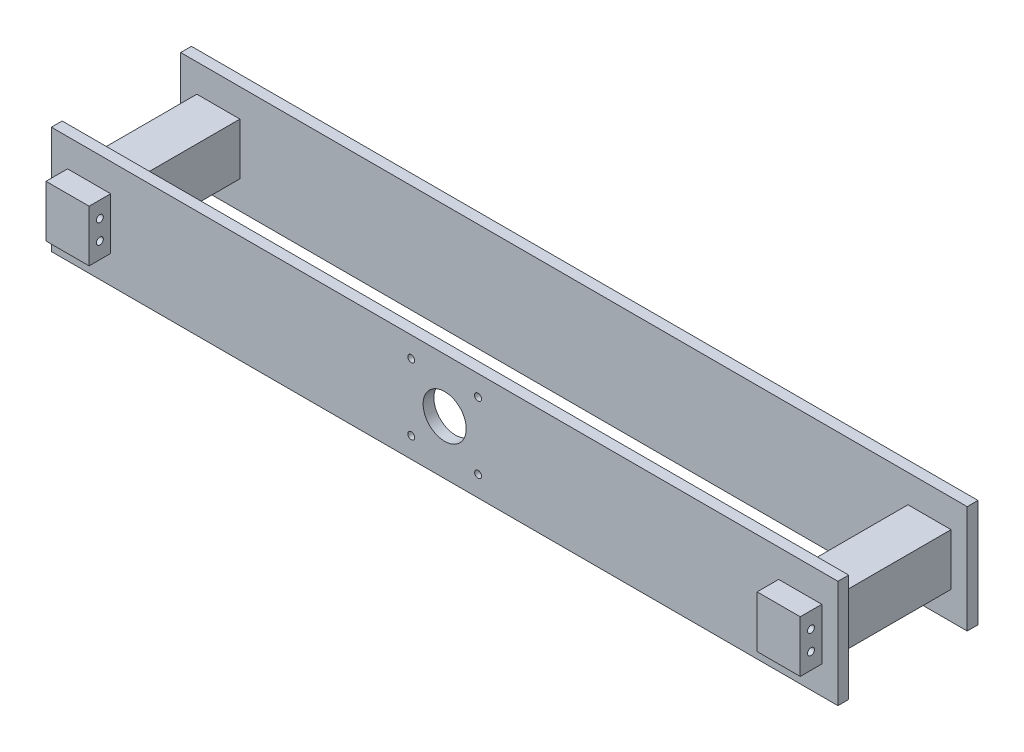
ISO-10303-21;
HEADER;
FILE_DESCRIPTION(('STEP AP214'),'2;1');
FILE_NAME('part.step','',(''),(''),'','','');
FILE_SCHEMA(('AUTOMOTIVE_DESIGN { 1 0 10303 214 1 1 1 1 }'));
ENDSEC;
DATA;
#1=APPLICATION_CONTEXT('core data for automotive mechanical design processes');
#2=APPLICATION_PROTOCOL_DEFINITION('international standard','automotive_design',2000,#1);
#3=PRODUCT_CONTEXT('',#1,'mechanical');
#4=PRODUCT('Part','Part','',(#3));
#5=PRODUCT_RELATED_PRODUCT_CATEGORY('part','',(#4));
#6=PRODUCT_DEFINITION_FORMATION('','',#4);
#7=PRODUCT_DEFINITION_CONTEXT('part definition',#1,'design');
#8=PRODUCT_DEFINITION('design','',#6,#7);
#9=PRODUCT_DEFINITION_SHAPE('','',#8);
#10=(LENGTH_UNIT() NAMED_UNIT(*) SI_UNIT(.MILLI.,.METRE.));
#11=(NAMED_UNIT(*) PLANE_ANGLE_UNIT() SI_UNIT($,.RADIAN.));
#12=(NAMED_UNIT(*) SI_UNIT($,.STERADIAN.) SOLID_ANGLE_UNIT());
#13=UNCERTAINTY_MEASURE_WITH_UNIT(LENGTH_MEASURE(1.E-05),#10,'distance_accuracy_value','');
#14=(GEOMETRIC_REPRESENTATION_CONTEXT(3) GLOBAL_UNCERTAINTY_ASSIGNED_CONTEXT((#13)) GLOBAL_UNIT_ASSIGNED_CONTEXT((#10,
#11,#12)) REPRESENTATION_CONTEXT('',''));
#15=CARTESIAN_POINT('',(0.,0.,0.));
#16=DIRECTION('',(0.,0.,1.));
#17=DIRECTION('',(1.,0.,0.));
#18=AXIS2_PLACEMENT_3D('',#15,#16,#17);
#19=CARTESIAN_POINT('',(0.,0.,2.5));
#20=DIRECTION('',(0.,0.,-1.));
#21=DIRECTION('',(-1.,0.,0.));
#22=AXIS2_PLACEMENT_3D('',#19,#20,#21);
#23=PLANE('',#22);
#24=DIRECTION('',(0.,1.,0.));
#25=VECTOR('',#24,1.);
#26=CARTESIAN_POINT('',(175.,-12.,2.5));
#27=LINE('',#26,#25);
#28=CARTESIAN_POINT('',(175.,-12.,2.5));
#29=VERTEX_POINT('',#28);
#30=CARTESIAN_POINT('',(175.,12.,2.5));
#31=VERTEX_POINT('',#30);
#32=EDGE_CURVE('E292',#29,#31,#27,.T.);
#33=ORIENTED_EDGE('',*,*,#32,.F.);
#34=DIRECTION('',(1.,0.,0.));
#35=VECTOR('',#34,1.);
#36=CARTESIAN_POINT('',(175.,-12.,2.5));
#37=LINE('',#36,#35);
#38=CARTESIAN_POINT('',(155.,-12.,2.5));
#39=VERTEX_POINT('',#38);
#40=EDGE_CURVE('E327',#39,#29,#37,.T.);
#41=ORIENTED_EDGE('',*,*,#40,.F.);
#42=DIRECTION('',(0.,-1.,0.));
#43=VECTOR('',#42,1.);
#44=CARTESIAN_POINT('',(155.,-12.,2.5));
#45=LINE('',#44,#43);
#46=CARTESIAN_POINT('',(155.,12.,2.5));
#47=VERTEX_POINT('',#46);
#48=EDGE_CURVE('E330',#47,#39,#45,.T.);
#49=ORIENTED_EDGE('',*,*,#48,.F.);
#50=DIRECTION('',(-1.,0.,0.));
#51=VECTOR('',#50,1.);
#52=CARTESIAN_POINT('',(175.,12.,2.5));
#53=LINE('',#52,#51);
#54=EDGE_CURVE('E334',#31,#47,#53,.T.);
#55=ORIENTED_EDGE('',*,*,#54,.F.);
#56=EDGE_LOOP('',(#33,#41,#49,#55));
#57=FACE_BOUND('',#56,.T.);
#58=DIRECTION('',(0.,1.,0.));
#59=VECTOR('',#58,1.);
#60=CARTESIAN_POINT('',(182.5,-25.,2.5));
#61=LINE('',#60,#59);
#62=CARTESIAN_POINT('',(182.5,-25.,2.5));
#63=VERTEX_POINT('',#62);
#64=CARTESIAN_POINT('',(182.5,25.,2.5));
#65=VERTEX_POINT('',#64);
#66=EDGE_CURVE('E346',#63,#65,#61,.T.);
#67=ORIENTED_EDGE('',*,*,#66,.T.);
#68=DIRECTION('',(-1.,0.,0.));
#69=VECTOR('',#68,1.);
#70=CARTESIAN_POINT('',(-182.5,25.,2.5));
#71=LINE('',#70,#69);
#72=CARTESIAN_POINT('',(-182.5,25.,2.5));
#73=VERTEX_POINT('',#72);
#74=EDGE_CURVE('E349',#65,#73,#71,.T.);
#75=ORIENTED_EDGE('',*,*,#74,.T.);
#76=DIRECTION('',(0.,-1.,0.));
#77=VECTOR('',#76,1.);
#78=CARTESIAN_POINT('',(-182.5,-25.,2.5));
#79=LINE('',#78,#77);
#80=CARTESIAN_POINT('',(-182.5,-25.,2.5));
#81=VERTEX_POINT('',#80);
#82=EDGE_CURVE('E352',#73,#81,#79,.T.);
#83=ORIENTED_EDGE('',*,*,#82,.T.);
#84=DIRECTION('',(1.,0.,0.));
#85=VECTOR('',#84,1.);
#86=CARTESIAN_POINT('',(-182.5,-25.,2.5));
#87=LINE('',#86,#85);
#88=EDGE_CURVE('E354',#81,#63,#87,.T.);
#89=ORIENTED_EDGE('',*,*,#88,.T.);
#90=EDGE_LOOP('',(#67,#75,#83,#89));
#91=FACE_BOUND('',#90,.T.);
#92=DIRECTION('',(0.,1.,0.));
#93=VECTOR('',#92,1.);
#94=CARTESIAN_POINT('',(-155.,-12.,2.5));
#95=LINE('',#94,#93);
#96=CARTESIAN_POINT('',(-155.,-12.,2.5));
#97=VERTEX_POINT('',#96);
#98=CARTESIAN_POINT('',(-155.,12.,2.5));
#99=VERTEX_POINT('',#98);
#100=EDGE_CURVE('E288',#97,#99,#95,.T.);
#101=ORIENTED_EDGE('',*,*,#100,.F.);
#102=DIRECTION('',(1.,0.,0.));
#103=VECTOR('',#102,1.);
#104=CARTESIAN_POINT('',(-175.,-12.,2.5));
#105=LINE('',#104,#103);
#106=CARTESIAN_POINT('',(-175.,-12.,2.5));
#107=VERTEX_POINT('',#106);
#108=EDGE_CURVE('E281',#107,#97,#105,.T.);
#109=ORIENTED_EDGE('',*,*,#108,.F.);
#110=DIRECTION('',(0.,-1.,0.));
#111=VECTOR('',#110,1.);
#112=CARTESIAN_POINT('',(-175.,-12.,2.5));
#113=LINE('',#112,#111);
#114=CARTESIAN_POINT('',(-175.,12.,2.5));
#115=VERTEX_POINT('',#114);
#116=EDGE_CURVE('E295',#115,#107,#113,.T.);
#117=ORIENTED_EDGE('',*,*,#116,.F.);
#118=DIRECTION('',(-1.,0.,0.));
#119=VECTOR('',#118,1.);
#120=CARTESIAN_POINT('',(-175.,12.,2.5));
#121=LINE('',#120,#119);
#122=EDGE_CURVE('E291',#99,#115,#121,.T.);
#123=ORIENTED_EDGE('',*,*,#122,.F.);
#124=EDGE_LOOP('',(#101,#109,#117,#123));
#125=FACE_BOUND('',#124,.T.);
#126=ADVANCED_FACE('F41',(#57,#91,#125),#23,.F.);
#127=CARTESIAN_POINT('',(182.5,-25.,2.5));
#128=DIRECTION('',(-1.,0.,0.));
#129=DIRECTION('',(0.,0.,1.));
#130=AXIS2_PLACEMENT_3D('',#127,#128,#129);
#131=PLANE('',#130);
#132=DIRECTION('',(0.,1.,0.));
#133=VECTOR('',#132,1.);
#134=CARTESIAN_POINT('',(182.5,-25.,-2.5));
#135=LINE('',#134,#133);
#136=CARTESIAN_POINT('',(182.5,-25.,-2.5));
#137=VERTEX_POINT('',#136);
#138=CARTESIAN_POINT('',(182.5,25.,-2.5));
#139=VERTEX_POINT('',#138);
#140=EDGE_CURVE('E314',#137,#139,#135,.T.);
#141=ORIENTED_EDGE('',*,*,#140,.T.);
#142=DIRECTION('',(0.,0.,-1.));
#143=VECTOR('',#142,1.);
#144=CARTESIAN_POINT('',(182.5,25.,2.5));
#145=LINE('',#144,#143);
#146=EDGE_CURVE('E372',#65,#139,#145,.T.);
#147=ORIENTED_EDGE('',*,*,#146,.F.);
#148=ORIENTED_EDGE('',*,*,#66,.F.);
#149=DIRECTION('',(0.,0.,-1.));
#150=VECTOR('',#149,1.);
#151=CARTESIAN_POINT('',(182.5,-25.,2.5));
#152=LINE('',#151,#150);
#153=EDGE_CURVE('E356',#63,#137,#152,.T.);
#154=ORIENTED_EDGE('',*,*,#153,.T.);
#155=EDGE_LOOP('',(#141,#147,#148,#154));
#156=FACE_BOUND('',#155,.T.);
#157=ADVANCED_FACE('F43',(#156),#131,.F.);
#158=CARTESIAN_POINT('',(-182.5,25.,2.5));
#159=DIRECTION('',(0.,-1.,0.));
#160=DIRECTION('',(0.,0.,-1.));
#161=AXIS2_PLACEMENT_3D('',#158,#159,#160);
#162=PLANE('',#161);
#163=DIRECTION('',(-1.,0.,0.));
#164=VECTOR('',#163,1.);
#165=CARTESIAN_POINT('',(-182.5,25.,-2.5));
#166=LINE('',#165,#164);
#167=CARTESIAN_POINT('',(-182.5,25.,-2.5));
#168=VERTEX_POINT('',#167);
#169=EDGE_CURVE('E359',#139,#168,#166,.T.);
#170=ORIENTED_EDGE('',*,*,#169,.T.);
#171=DIRECTION('',(0.,0.,-1.));
#172=VECTOR('',#171,1.);
#173=CARTESIAN_POINT('',(-182.5,25.,2.5));
#174=LINE('',#173,#172);
#175=EDGE_CURVE('E369',#73,#168,#174,.T.);
#176=ORIENTED_EDGE('',*,*,#175,.F.);
#177=ORIENTED_EDGE('',*,*,#74,.F.);
#178=ORIENTED_EDGE('',*,*,#146,.T.);
#179=EDGE_LOOP('',(#170,#176,#177,#178));
#180=FACE_BOUND('',#179,.T.);
#181=ADVANCED_FACE('F434',(#180),#162,.F.);
#182=CARTESIAN_POINT('',(-182.5,-25.,2.5));
#183=DIRECTION('',(1.,0.,0.));
#184=DIRECTION('',(0.,0.,-1.));
#185=AXIS2_PLACEMENT_3D('',#182,#183,#184);
#186=PLANE('',#185);
#187=DIRECTION('',(0.,-1.,0.));
#188=VECTOR('',#187,1.);
#189=CARTESIAN_POINT('',(-182.5,-25.,-2.5));
#190=LINE('',#189,#188);
#191=CARTESIAN_POINT('',(-182.5,-25.,-2.5));
#192=VERTEX_POINT('',#191);
#193=EDGE_CURVE('E361',#168,#192,#190,.T.);
#194=ORIENTED_EDGE('',*,*,#193,.T.);
#195=DIRECTION('',(0.,0.,-1.));
#196=VECTOR('',#195,1.);
#197=CARTESIAN_POINT('',(-182.5,-25.,2.5));
#198=LINE('',#197,#196);
#199=EDGE_CURVE('E366',#81,#192,#198,.T.);
#200=ORIENTED_EDGE('',*,*,#199,.F.);
#201=ORIENTED_EDGE('',*,*,#82,.F.);
#202=ORIENTED_EDGE('',*,*,#175,.T.);
#203=EDGE_LOOP('',(#194,#200,#201,#202));
#204=FACE_BOUND('',#203,.T.);
#205=ADVANCED_FACE('F449',(#204),#186,.F.);
#206=CARTESIAN_POINT('',(-182.5,-25.,2.5));
#207=DIRECTION('',(0.,1.,0.));
#208=DIRECTION('',(0.,0.,1.));
#209=AXIS2_PLACEMENT_3D('',#206,#207,#208);
#210=PLANE('',#209);
#211=DIRECTION('',(1.,0.,0.));
#212=VECTOR('',#211,1.);
#213=CARTESIAN_POINT('',(-182.5,-25.,-2.5));
#214=LINE('',#213,#212);
#215=EDGE_CURVE('E350',#192,#137,#214,.T.);
#216=ORIENTED_EDGE('',*,*,#215,.T.);
#217=ORIENTED_EDGE('',*,*,#153,.F.);
#218=ORIENTED_EDGE('',*,*,#88,.F.);
#219=ORIENTED_EDGE('',*,*,#199,.T.);
#220=EDGE_LOOP('',(#216,#217,#218,#219));
#221=FACE_BOUND('',#220,.T.);
#222=ADVANCED_FACE('F445',(#221),#210,.F.);
#223=CARTESIAN_POINT('',(0.,0.,-2.5));
#224=DIRECTION('',(0.,0.,-1.));
#225=DIRECTION('',(-1.,0.,0.));
#226=AXIS2_PLACEMENT_3D('',#223,#224,#225);
#227=PLANE('',#226);
#228=ORIENTED_EDGE('',*,*,#140,.F.);
#229=ORIENTED_EDGE('',*,*,#215,.F.);
#230=ORIENTED_EDGE('',*,*,#193,.F.);
#231=ORIENTED_EDGE('',*,*,#169,.F.);
#232=EDGE_LOOP('',(#228,#229,#230,#231));
#233=FACE_BOUND('',#232,.T.);
#234=ADVANCED_FACE('F442',(#233),#227,.T.);
#235=CARTESIAN_POINT('',(175.,-12.,72.5));
#236=DIRECTION('',(-1.,0.,0.));
#237=DIRECTION('',(0.,0.,1.));
#238=AXIS2_PLACEMENT_3D('',#235,#236,#237);
#239=PLANE('',#238);
#240=DIRECTION('',(0.,0.,-1.));
#241=VECTOR('',#240,1.);
#242=CARTESIAN_POINT('',(175.,12.,72.5));
#243=LINE('',#242,#241);
#244=CARTESIAN_POINT('',(175.,12.,57.5));
#245=VERTEX_POINT('',#244);
#246=EDGE_CURVE('E276',#245,#31,#243,.T.);
#247=ORIENTED_EDGE('',*,*,#246,.F.);
#248=DIRECTION('',(0.,-1.,0.));
#249=VECTOR('',#248,1.);
#250=CARTESIAN_POINT('',(175.,-12.,57.5));
#251=LINE('',#250,#249);
#252=CARTESIAN_POINT('',(175.,-12.,57.5));
#253=VERTEX_POINT('',#252);
#254=EDGE_CURVE('E256',#245,#253,#251,.T.);
#255=ORIENTED_EDGE('',*,*,#254,.T.);
#256=DIRECTION('',(0.,0.,-1.));
#257=VECTOR('',#256,1.);
#258=CARTESIAN_POINT('',(175.,-12.,72.5));
#259=LINE('',#258,#257);
#260=EDGE_CURVE('E323',#253,#29,#259,.T.);
#261=ORIENTED_EDGE('',*,*,#260,.T.);
#262=ORIENTED_EDGE('',*,*,#32,.T.);
#263=EDGE_LOOP('',(#247,#255,#261,#262));
#264=FACE_BOUND('',#263,.T.);
#265=ADVANCED_FACE('F444',(#264),#239,.F.);
#266=CARTESIAN_POINT('',(175.,12.,72.5));
#267=DIRECTION('',(0.,-1.,0.));
#268=DIRECTION('',(1.,0.,0.));
#269=AXIS2_PLACEMENT_3D('',#266,#267,#268);
#270=PLANE('',#269);
#271=DIRECTION('',(0.,0.,-1.));
#272=VECTOR('',#271,1.);
#273=CARTESIAN_POINT('',(155.,12.,72.5));
#274=LINE('',#273,#272);
#275=CARTESIAN_POINT('',(155.,12.,57.5));
#276=VERTEX_POINT('',#275);
#277=EDGE_CURVE('E317',#276,#47,#274,.T.);
#278=ORIENTED_EDGE('',*,*,#277,.F.);
#279=DIRECTION('',(1.,0.,0.));
#280=VECTOR('',#279,1.);
#281=CARTESIAN_POINT('',(175.,12.,57.5));
#282=LINE('',#281,#280);
#283=EDGE_CURVE('E253',#276,#245,#282,.T.);
#284=ORIENTED_EDGE('',*,*,#283,.T.);
#285=ORIENTED_EDGE('',*,*,#246,.T.);
#286=ORIENTED_EDGE('',*,*,#54,.T.);
#287=EDGE_LOOP('',(#278,#284,#285,#286));
#288=FACE_BOUND('',#287,.T.);
#289=ADVANCED_FACE('F606',(#288),#270,.F.);
#290=CARTESIAN_POINT('',(155.,-12.,72.5));
#291=DIRECTION('',(1.,0.,0.));
#292=DIRECTION('',(0.,0.,-1.));
#293=AXIS2_PLACEMENT_3D('',#290,#291,#292);
#294=PLANE('',#293);
#295=DIRECTION('',(0.,0.,-1.));
#296=VECTOR('',#295,1.);
#297=CARTESIAN_POINT('',(155.,-12.,72.5));
#298=LINE('',#297,#296);
#299=CARTESIAN_POINT('',(155.,-12.,57.5));
#300=VERTEX_POINT('',#299);
#301=EDGE_CURVE('E320',#300,#39,#298,.T.);
#302=ORIENTED_EDGE('',*,*,#301,.F.);
#303=DIRECTION('',(0.,1.,0.));
#304=VECTOR('',#303,1.);
#305=CARTESIAN_POINT('',(155.,-12.,57.5));
#306=LINE('',#305,#304);
#307=EDGE_CURVE('E250',#300,#276,#306,.T.);
#308=ORIENTED_EDGE('',*,*,#307,.T.);
#309=ORIENTED_EDGE('',*,*,#277,.T.);
#310=ORIENTED_EDGE('',*,*,#48,.T.);
#311=EDGE_LOOP('',(#302,#308,#309,#310));
#312=FACE_BOUND('',#311,.T.);
#313=ADVANCED_FACE('F614',(#312),#294,.F.);
#314=CARTESIAN_POINT('',(175.,-12.,72.5));
#315=DIRECTION('',(0.,1.,0.));
#316=DIRECTION('',(-1.,0.,0.));
#317=AXIS2_PLACEMENT_3D('',#314,#315,#316);
#318=PLANE('',#317);
#319=ORIENTED_EDGE('',*,*,#260,.F.);
#320=DIRECTION('',(-1.,0.,0.));
#321=VECTOR('',#320,1.);
#322=CARTESIAN_POINT('',(175.,-12.,57.5));
#323=LINE('',#322,#321);
#324=EDGE_CURVE('E247',#253,#300,#323,.T.);
#325=ORIENTED_EDGE('',*,*,#324,.T.);
#326=ORIENTED_EDGE('',*,*,#301,.T.);
#327=ORIENTED_EDGE('',*,*,#40,.T.);
#328=EDGE_LOOP('',(#319,#325,#326,#327));
#329=FACE_BOUND('',#328,.T.);
#330=ADVANCED_FACE('F625',(#329),#318,.F.);
#331=CARTESIAN_POINT('',(-155.,-12.,72.5));
#332=DIRECTION('',(-1.,0.,0.));
#333=DIRECTION('',(0.,0.,1.));
#334=AXIS2_PLACEMENT_3D('',#331,#332,#333);
#335=PLANE('',#334);
#336=DIRECTION('',(0.,0.,-1.));
#337=VECTOR('',#336,1.);
#338=CARTESIAN_POINT('',(-155.,12.,72.5));
#339=LINE('',#338,#337);
#340=CARTESIAN_POINT('',(-155.,12.,57.5));
#341=VERTEX_POINT('',#340);
#342=EDGE_CURVE('E310',#341,#99,#339,.T.);
#343=ORIENTED_EDGE('',*,*,#342,.F.);
#344=DIRECTION('',(0.,-1.,0.));
#345=VECTOR('',#344,1.);
#346=CARTESIAN_POINT('',(-155.,-12.,57.5));
#347=LINE('',#346,#345);
#348=CARTESIAN_POINT('',(-155.,-12.,57.5));
#349=VERTEX_POINT('',#348);
#350=EDGE_CURVE('E244',#341,#349,#347,.T.);
#351=ORIENTED_EDGE('',*,*,#350,.T.);
#352=DIRECTION('',(0.,0.,-1.));
#353=VECTOR('',#352,1.);
#354=CARTESIAN_POINT('',(-155.,-12.,72.5));
#355=LINE('',#354,#353);
#356=EDGE_CURVE('E287',#349,#97,#355,.T.);
#357=ORIENTED_EDGE('',*,*,#356,.T.);
#358=ORIENTED_EDGE('',*,*,#100,.T.);
#359=EDGE_LOOP('',(#343,#351,#357,#358));
#360=FACE_BOUND('',#359,.T.);
#361=ADVANCED_FACE('F483',(#360),#335,.F.);
#362=CARTESIAN_POINT('',(-175.,12.,72.5));
#363=DIRECTION('',(0.,-1.,0.));
#364=DIRECTION('',(1.,0.,0.));
#365=AXIS2_PLACEMENT_3D('',#362,#363,#364);
#366=PLANE('',#365);
#367=DIRECTION('',(0.,0.,-1.));
#368=VECTOR('',#367,1.);
#369=CARTESIAN_POINT('',(-175.,12.,72.5));
#370=LINE('',#369,#368);
#371=CARTESIAN_POINT('',(-175.,12.,57.5));
#372=VERTEX_POINT('',#371);
#373=EDGE_CURVE('E306',#372,#115,#370,.T.);
#374=ORIENTED_EDGE('',*,*,#373,.F.);
#375=DIRECTION('',(1.,0.,0.));
#376=VECTOR('',#375,1.);
#377=CARTESIAN_POINT('',(-175.,12.,57.5));
#378=LINE('',#377,#376);
#379=EDGE_CURVE('E236',#372,#341,#378,.T.);
#380=ORIENTED_EDGE('',*,*,#379,.T.);
#381=ORIENTED_EDGE('',*,*,#342,.T.);
#382=ORIENTED_EDGE('',*,*,#122,.T.);
#383=EDGE_LOOP('',(#374,#380,#381,#382));
#384=FACE_BOUND('',#383,.T.);
#385=ADVANCED_FACE('F482',(#384),#366,.F.);
#386=CARTESIAN_POINT('',(-175.,-12.,72.5));
#387=DIRECTION('',(1.,0.,0.));
#388=DIRECTION('',(0.,0.,-1.));
#389=AXIS2_PLACEMENT_3D('',#386,#387,#388);
#390=PLANE('',#389);
#391=DIRECTION('',(0.,0.,-1.));
#392=VECTOR('',#391,1.);
#393=CARTESIAN_POINT('',(-175.,-12.,72.5));
#394=LINE('',#393,#392);
#395=CARTESIAN_POINT('',(-175.,-12.,57.5));
#396=VERTEX_POINT('',#395);
#397=EDGE_CURVE('E303',#396,#107,#394,.T.);
#398=ORIENTED_EDGE('',*,*,#397,.F.);
#399=DIRECTION('',(0.,1.,0.));
#400=VECTOR('',#399,1.);
#401=CARTESIAN_POINT('',(-175.,-12.,57.5));
#402=LINE('',#401,#400);
#403=EDGE_CURVE('E233',#396,#372,#402,.T.);
#404=ORIENTED_EDGE('',*,*,#403,.T.);
#405=ORIENTED_EDGE('',*,*,#373,.T.);
#406=ORIENTED_EDGE('',*,*,#116,.T.);
#407=EDGE_LOOP('',(#398,#404,#405,#406));
#408=FACE_BOUND('',#407,.T.);
#409=ADVANCED_FACE('F479',(#408),#390,.F.);
#410=CARTESIAN_POINT('',(-175.,-12.,72.5));
#411=DIRECTION('',(0.,1.,0.));
#412=DIRECTION('',(-1.,0.,0.));
#413=AXIS2_PLACEMENT_3D('',#410,#411,#412);
#414=PLANE('',#413);
#415=ORIENTED_EDGE('',*,*,#356,.F.);
#416=DIRECTION('',(-1.,0.,0.));
#417=VECTOR('',#416,1.);
#418=CARTESIAN_POINT('',(-175.,-12.,57.5));
#419=LINE('',#418,#417);
#420=EDGE_CURVE('E50',#349,#396,#419,.T.);
#421=ORIENTED_EDGE('',*,*,#420,.T.);
#422=ORIENTED_EDGE('',*,*,#397,.T.);
#423=ORIENTED_EDGE('',*,*,#108,.T.);
#424=EDGE_LOOP('',(#415,#421,#422,#423));
#425=FACE_BOUND('',#424,.T.);
#426=ADVANCED_FACE('F476',(#425),#414,.F.);
#427=CARTESIAN_POINT('',(0.,0.,62.5));
#428=DIRECTION('',(0.,0.,-1.));
#429=DIRECTION('',(-1.,0.,0.));
#430=AXIS2_PLACEMENT_3D('',#427,#428,#429);
#431=PLANE('',#430);
#432=CARTESIAN_POINT('',(-15.5000000000002,-15.4999999999998,62.5));
#433=DIRECTION('',(0.,0.,1.));
#434=DIRECTION('',(1.,0.,0.));
#435=AXIS2_PLACEMENT_3D('',#432,#433,#434);
#436=CIRCLE('',#435,1.6);
#437=CARTESIAN_POINT('',(-13.9000000000002,-15.4999999999998,62.5));
#438=VERTEX_POINT('',#437);
#439=EDGE_CURVE('E538',#438,#438,#436,.T.);
#440=ORIENTED_EDGE('',*,*,#439,.F.);
#441=EDGE_LOOP('',(#440));
#442=FACE_BOUND('',#441,.T.);
#443=CARTESIAN_POINT('',(15.4999999999999,-15.5000000000001,62.5));
#444=DIRECTION('',(0.,0.,1.));
#445=DIRECTION('',(1.,0.,0.));
#446=AXIS2_PLACEMENT_3D('',#443,#444,#445);
#447=CIRCLE('',#446,1.6);
#448=CARTESIAN_POINT('',(17.0999999999999,-15.5000000000001,62.5));
#449=VERTEX_POINT('',#448);
#450=EDGE_CURVE('E563',#449,#449,#447,.T.);
#451=ORIENTED_EDGE('',*,*,#450,.F.);
#452=EDGE_LOOP('',(#451));
#453=FACE_BOUND('',#452,.T.);
#454=CARTESIAN_POINT('',(15.5000000000001,15.4999999999999,62.5));
#455=DIRECTION('',(0.,0.,1.));
#456=DIRECTION('',(1.,0.,0.));
#457=AXIS2_PLACEMENT_3D('',#454,#455,#456);
#458=CIRCLE('',#457,1.6);
#459=CARTESIAN_POINT('',(17.1000000000001,15.4999999999999,62.5));
#460=VERTEX_POINT('',#459);
#461=EDGE_CURVE('E557',#460,#460,#458,.T.);
#462=ORIENTED_EDGE('',*,*,#461,.F.);
#463=EDGE_LOOP('',(#462));
#464=FACE_BOUND('',#463,.T.);
#465=CARTESIAN_POINT('',(0.,0.,62.5));
#466=DIRECTION('',(0.,0.,1.));
#467=DIRECTION('',(1.,0.,0.));
#468=AXIS2_PLACEMENT_3D('',#465,#466,#467);
#469=CIRCLE('',#468,10.);
#470=CARTESIAN_POINT('',(10.,0.,62.5));
#471=VERTEX_POINT('',#470);
#472=EDGE_CURVE('E551',#471,#471,#469,.T.);
#473=ORIENTED_EDGE('',*,*,#472,.F.);
#474=EDGE_LOOP('',(#473));
#475=FACE_BOUND('',#474,.T.);
#476=CARTESIAN_POINT('',(-15.5,15.5,62.5));
#477=DIRECTION('',(0.,0.,1.));
#478=DIRECTION('',(1.,0.,0.));
#479=AXIS2_PLACEMENT_3D('',#476,#477,#478);
#480=CIRCLE('',#479,1.6);
#481=CARTESIAN_POINT('',(-13.9,15.5,62.5));
#482=VERTEX_POINT('',#481);
#483=EDGE_CURVE('E386',#482,#482,#480,.T.);
#484=ORIENTED_EDGE('',*,*,#483,.F.);
#485=EDGE_LOOP('',(#484));
#486=FACE_BOUND('',#485,.T.);
#487=DIRECTION('',(0.,1.,0.));
#488=VECTOR('',#487,1.);
#489=CARTESIAN_POINT('',(182.5,-25.,62.5));
#490=LINE('',#489,#488);
#491=CARTESIAN_POINT('',(182.5,-25.,62.5));
#492=VERTEX_POINT('',#491);
#493=CARTESIAN_POINT('',(182.5,25.,62.5));
#494=VERTEX_POINT('',#493);
#495=EDGE_CURVE('E218',#492,#494,#490,.T.);
#496=ORIENTED_EDGE('',*,*,#495,.T.);
#497=DIRECTION('',(-1.,0.,0.));
#498=VECTOR('',#497,1.);
#499=CARTESIAN_POINT('',(-182.5,25.,62.5));
#500=LINE('',#499,#498);
#501=CARTESIAN_POINT('',(-182.5,25.,62.5));
#502=VERTEX_POINT('',#501);
#503=EDGE_CURVE('E207',#494,#502,#500,.T.);
#504=ORIENTED_EDGE('',*,*,#503,.T.);
#505=DIRECTION('',(0.,-1.,0.));
#506=VECTOR('',#505,1.);
#507=CARTESIAN_POINT('',(-182.5,-25.,62.5));
#508=LINE('',#507,#506);
#509=CARTESIAN_POINT('',(-182.5,-25.,62.5));
#510=VERTEX_POINT('',#509);
#511=EDGE_CURVE('E217',#502,#510,#508,.T.);
#512=ORIENTED_EDGE('',*,*,#511,.T.);
#513=DIRECTION('',(1.,0.,0.));
#514=VECTOR('',#513,1.);
#515=CARTESIAN_POINT('',(-182.5,-25.,62.5));
#516=LINE('',#515,#514);
#517=EDGE_CURVE('E224',#510,#492,#516,.T.);
#518=ORIENTED_EDGE('',*,*,#517,.T.);
#519=EDGE_LOOP('',(#496,#504,#512,#518));
#520=FACE_BOUND('',#519,.T.);
#521=DIRECTION('',(1.,0.,0.));
#522=VECTOR('',#521,1.);
#523=CARTESIAN_POINT('',(-175.,12.,62.5));
#524=LINE('',#523,#522);
#525=CARTESIAN_POINT('',(-175.,12.,62.5));
#526=VERTEX_POINT('',#525);
#527=CARTESIAN_POINT('',(-155.,12.,62.5));
#528=VERTEX_POINT('',#527);
#529=EDGE_CURVE('E262',#526,#528,#524,.T.);
#530=ORIENTED_EDGE('',*,*,#529,.T.);
#531=DIRECTION('',(0.,-1.,0.));
#532=VECTOR('',#531,1.);
#533=CARTESIAN_POINT('',(-155.,-12.,62.5));
#534=LINE('',#533,#532);
#535=CARTESIAN_POINT('',(-155.,-12.,62.5));
#536=VERTEX_POINT('',#535);
#537=EDGE_CURVE('E265',#528,#536,#534,.T.);
#538=ORIENTED_EDGE('',*,*,#537,.T.);
#539=DIRECTION('',(-1.,0.,0.));
#540=VECTOR('',#539,1.);
#541=CARTESIAN_POINT('',(-175.,-12.,62.5));
#542=LINE('',#541,#540);
#543=CARTESIAN_POINT('',(-175.,-12.,62.5));
#544=VERTEX_POINT('',#543);
#545=EDGE_CURVE('E11',#536,#544,#542,.T.);
#546=ORIENTED_EDGE('',*,*,#545,.T.);
#547=DIRECTION('',(0.,1.,0.));
#548=VECTOR('',#547,1.);
#549=CARTESIAN_POINT('',(-175.,-12.,62.5));
#550=LINE('',#549,#548);
#551=EDGE_CURVE('E259',#544,#526,#550,.T.);
#552=ORIENTED_EDGE('',*,*,#551,.T.);
#553=EDGE_LOOP('',(#530,#538,#546,#552));
#554=FACE_BOUND('',#553,.T.);
#555=DIRECTION('',(1.,0.,0.));
#556=VECTOR('',#555,1.);
#557=CARTESIAN_POINT('',(175.,12.,62.5));
#558=LINE('',#557,#556);
#559=CARTESIAN_POINT('',(155.,12.,62.5));
#560=VERTEX_POINT('',#559);
#561=CARTESIAN_POINT('',(175.,12.,62.5));
#562=VERTEX_POINT('',#561);
#563=EDGE_CURVE('E65',#560,#562,#558,.T.);
#564=ORIENTED_EDGE('',*,*,#563,.T.);
#565=DIRECTION('',(0.,-1.,0.));
#566=VECTOR('',#565,1.);
#567=CARTESIAN_POINT('',(175.,-12.,62.5));
#568=LINE('',#567,#566);
#569=CARTESIAN_POINT('',(175.,-12.,62.5));
#570=VERTEX_POINT('',#569);
#571=EDGE_CURVE('E58',#562,#570,#568,.T.);
#572=ORIENTED_EDGE('',*,*,#571,.T.);
#573=DIRECTION('',(-1.,0.,0.));
#574=VECTOR('',#573,1.);
#575=CARTESIAN_POINT('',(175.,-12.,62.5));
#576=LINE('',#575,#574);
#577=CARTESIAN_POINT('',(155.,-12.,62.5));
#578=VERTEX_POINT('',#577);
#579=EDGE_CURVE('E268',#570,#578,#576,.T.);
#580=ORIENTED_EDGE('',*,*,#579,.T.);
#581=DIRECTION('',(0.,1.,0.));
#582=VECTOR('',#581,1.);
#583=CARTESIAN_POINT('',(155.,-12.,62.5));
#584=LINE('',#583,#582);
#585=EDGE_CURVE('E271',#578,#560,#584,.T.);
#586=ORIENTED_EDGE('',*,*,#585,.T.);
#587=EDGE_LOOP('',(#564,#572,#580,#586));
#588=FACE_BOUND('',#587,.T.);
#589=ADVANCED_FACE('F221',(#442,#453,#464,#475,#486,#520,#554,#588),#431,.F.);
#590=CARTESIAN_POINT('',(0.,0.,57.5));
#591=DIRECTION('',(0.,0.,-1.));
#592=DIRECTION('',(-1.,0.,0.));
#593=AXIS2_PLACEMENT_3D('',#590,#591,#592);
#594=PLANE('',#593);
#595=CARTESIAN_POINT('',(-15.5000000000002,-15.4999999999998,57.5));
#596=DIRECTION('',(0.,0.,-1.));
#597=DIRECTION('',(-1.,0.,0.));
#598=AXIS2_PLACEMENT_3D('',#595,#596,#597);
#599=CIRCLE('',#598,1.6);
#600=CARTESIAN_POINT('',(-17.1000000000002,-15.4999999999998,57.5));
#601=VERTEX_POINT('',#600);
#602=EDGE_CURVE('E542',#601,#601,#599,.F.);
#603=ORIENTED_EDGE('',*,*,#602,.T.);
#604=EDGE_LOOP('',(#603));
#605=FACE_BOUND('',#604,.T.);
#606=CARTESIAN_POINT('',(15.4999999999999,-15.5000000000001,57.5));
#607=DIRECTION('',(0.,0.,-1.));
#608=DIRECTION('',(-1.,0.,0.));
#609=AXIS2_PLACEMENT_3D('',#606,#607,#608);
#610=CIRCLE('',#609,1.6);
#611=CARTESIAN_POINT('',(13.8999999999999,-15.5000000000001,57.5));
#612=VERTEX_POINT('',#611);
#613=EDGE_CURVE('E560',#612,#612,#610,.F.);
#614=ORIENTED_EDGE('',*,*,#613,.T.);
#615=EDGE_LOOP('',(#614));
#616=FACE_BOUND('',#615,.T.);
#617=CARTESIAN_POINT('',(15.5000000000001,15.4999999999999,57.5));
#618=DIRECTION('',(0.,0.,-1.));
#619=DIRECTION('',(-1.,0.,0.));
#620=AXIS2_PLACEMENT_3D('',#617,#618,#619);
#621=CIRCLE('',#620,1.6);
#622=CARTESIAN_POINT('',(13.9000000000001,15.4999999999999,57.5));
#623=VERTEX_POINT('',#622);
#624=EDGE_CURVE('E554',#623,#623,#621,.F.);
#625=ORIENTED_EDGE('',*,*,#624,.T.);
#626=EDGE_LOOP('',(#625));
#627=FACE_BOUND('',#626,.T.);
#628=CARTESIAN_POINT('',(0.,0.,57.5));
#629=DIRECTION('',(0.,0.,-1.));
#630=DIRECTION('',(-1.,0.,0.));
#631=AXIS2_PLACEMENT_3D('',#628,#629,#630);
#632=CIRCLE('',#631,10.);
#633=CARTESIAN_POINT('',(-10.,0.,57.5));
#634=VERTEX_POINT('',#633);
#635=EDGE_CURVE('E548',#634,#634,#632,.F.);
#636=ORIENTED_EDGE('',*,*,#635,.T.);
#637=EDGE_LOOP('',(#636));
#638=FACE_BOUND('',#637,.T.);
#639=CARTESIAN_POINT('',(-15.5,15.5,57.5));
#640=DIRECTION('',(0.,0.,-1.));
#641=DIRECTION('',(-1.,0.,0.));
#642=AXIS2_PLACEMENT_3D('',#639,#640,#641);
#643=CIRCLE('',#642,1.6);
#644=CARTESIAN_POINT('',(-17.1,15.5,57.5));
#645=VERTEX_POINT('',#644);
#646=EDGE_CURVE('E391',#645,#645,#643,.F.);
#647=ORIENTED_EDGE('',*,*,#646,.T.);
#648=EDGE_LOOP('',(#647));
#649=FACE_BOUND('',#648,.T.);
#650=ORIENTED_EDGE('',*,*,#350,.F.);
#651=ORIENTED_EDGE('',*,*,#379,.F.);
#652=ORIENTED_EDGE('',*,*,#403,.F.);
#653=ORIENTED_EDGE('',*,*,#420,.F.);
#654=EDGE_LOOP('',(#650,#651,#652,#653));
#655=FACE_BOUND('',#654,.T.);
#656=DIRECTION('',(0.,1.,0.));
#657=VECTOR('',#656,1.);
#658=CARTESIAN_POINT('',(182.5,-25.,57.5));
#659=LINE('',#658,#657);
#660=CARTESIAN_POINT('',(182.5,-25.,57.5));
#661=VERTEX_POINT('',#660);
#662=CARTESIAN_POINT('',(182.5,25.,57.5));
#663=VERTEX_POINT('',#662);
#664=EDGE_CURVE('E232',#661,#663,#659,.T.);
#665=ORIENTED_EDGE('',*,*,#664,.F.);
#666=DIRECTION('',(1.,0.,0.));
#667=VECTOR('',#666,1.);
#668=CARTESIAN_POINT('',(-182.5,-25.,57.5));
#669=LINE('',#668,#667);
#670=CARTESIAN_POINT('',(-182.5,-25.,57.5));
#671=VERTEX_POINT('',#670);
#672=EDGE_CURVE('E228',#671,#661,#669,.T.);
#673=ORIENTED_EDGE('',*,*,#672,.F.);
#674=DIRECTION('',(0.,-1.,0.));
#675=VECTOR('',#674,1.);
#676=CARTESIAN_POINT('',(-182.5,-25.,57.5));
#677=LINE('',#676,#675);
#678=CARTESIAN_POINT('',(-182.5,25.,57.5));
#679=VERTEX_POINT('',#678);
#680=EDGE_CURVE('E403',#679,#671,#677,.T.);
#681=ORIENTED_EDGE('',*,*,#680,.F.);
#682=DIRECTION('',(-1.,0.,0.));
#683=VECTOR('',#682,1.);
#684=CARTESIAN_POINT('',(-182.5,25.,57.5));
#685=LINE('',#684,#683);
#686=EDGE_CURVE('E401',#663,#679,#685,.T.);
#687=ORIENTED_EDGE('',*,*,#686,.F.);
#688=EDGE_LOOP('',(#665,#673,#681,#687));
#689=FACE_BOUND('',#688,.T.);
#690=ORIENTED_EDGE('',*,*,#254,.F.);
#691=ORIENTED_EDGE('',*,*,#283,.F.);
#692=ORIENTED_EDGE('',*,*,#307,.F.);
#693=ORIENTED_EDGE('',*,*,#324,.F.);
#694=EDGE_LOOP('',(#690,#691,#692,#693));
#695=FACE_BOUND('',#694,.T.);
#696=ADVANCED_FACE('F414',(#605,#616,#627,#638,#649,#655,#689,#695),#594,.T.);
#697=CARTESIAN_POINT('',(182.5,-25.,62.5));
#698=DIRECTION('',(-1.,0.,0.));
#699=DIRECTION('',(0.,0.,1.));
#700=AXIS2_PLACEMENT_3D('',#697,#698,#699);
#701=PLANE('',#700);
#702=ORIENTED_EDGE('',*,*,#664,.T.);
#703=DIRECTION('',(0.,0.,-1.));
#704=VECTOR('',#703,1.);
#705=CARTESIAN_POINT('',(182.5,25.,62.5));
#706=LINE('',#705,#704);
#707=EDGE_CURVE('E211',#494,#663,#706,.T.);
#708=ORIENTED_EDGE('',*,*,#707,.F.);
#709=ORIENTED_EDGE('',*,*,#495,.F.);
#710=DIRECTION('',(0.,0.,-1.));
#711=VECTOR('',#710,1.);
#712=CARTESIAN_POINT('',(182.5,-25.,62.5));
#713=LINE('',#712,#711);
#714=EDGE_CURVE('E399',#492,#661,#713,.T.);
#715=ORIENTED_EDGE('',*,*,#714,.T.);
#716=EDGE_LOOP('',(#702,#708,#709,#715));
#717=FACE_BOUND('',#716,.T.);
#718=ADVANCED_FACE('F230',(#717),#701,.F.);
#719=CARTESIAN_POINT('',(-182.5,25.,62.5));
#720=DIRECTION('',(0.,-1.,0.));
#721=DIRECTION('',(0.,0.,-1.));
#722=AXIS2_PLACEMENT_3D('',#719,#720,#721);
#723=PLANE('',#722);
#724=ORIENTED_EDGE('',*,*,#686,.T.);
#725=DIRECTION('',(0.,0.,-1.));
#726=VECTOR('',#725,1.);
#727=CARTESIAN_POINT('',(-182.5,25.,62.5));
#728=LINE('',#727,#726);
#729=EDGE_CURVE('E214',#502,#679,#728,.T.);
#730=ORIENTED_EDGE('',*,*,#729,.F.);
#731=ORIENTED_EDGE('',*,*,#503,.F.);
#732=ORIENTED_EDGE('',*,*,#707,.T.);
#733=EDGE_LOOP('',(#724,#730,#731,#732));
#734=FACE_BOUND('',#733,.T.);
#735=ADVANCED_FACE('F209',(#734),#723,.F.);
#736=CARTESIAN_POINT('',(-182.5,-25.,62.5));
#737=DIRECTION('',(1.,0.,0.));
#738=DIRECTION('',(0.,0.,-1.));
#739=AXIS2_PLACEMENT_3D('',#736,#737,#738);
#740=PLANE('',#739);
#741=ORIENTED_EDGE('',*,*,#680,.T.);
#742=DIRECTION('',(0.,0.,-1.));
#743=VECTOR('',#742,1.);
#744=CARTESIAN_POINT('',(-182.5,-25.,62.5));
#745=LINE('',#744,#743);
#746=EDGE_CURVE('E238',#510,#671,#745,.T.);
#747=ORIENTED_EDGE('',*,*,#746,.F.);
#748=ORIENTED_EDGE('',*,*,#511,.F.);
#749=ORIENTED_EDGE('',*,*,#729,.T.);
#750=EDGE_LOOP('',(#741,#747,#748,#749));
#751=FACE_BOUND('',#750,.T.);
#752=ADVANCED_FACE('F416',(#751),#740,.F.);
#753=CARTESIAN_POINT('',(-182.5,-25.,62.5));
#754=DIRECTION('',(0.,1.,0.));
#755=DIRECTION('',(0.,0.,1.));
#756=AXIS2_PLACEMENT_3D('',#753,#754,#755);
#757=PLANE('',#756);
#758=ORIENTED_EDGE('',*,*,#672,.T.);
#759=ORIENTED_EDGE('',*,*,#714,.F.);
#760=ORIENTED_EDGE('',*,*,#517,.F.);
#761=ORIENTED_EDGE('',*,*,#746,.T.);
#762=EDGE_LOOP('',(#758,#759,#760,#761));
#763=FACE_BOUND('',#762,.T.);
#764=ADVANCED_FACE('F410',(#763),#757,.F.);
#765=CARTESIAN_POINT('',(0.,0.,72.5));
#766=DIRECTION('',(0.,0.,-1.));
#767=DIRECTION('',(-1.,0.,0.));
#768=AXIS2_PLACEMENT_3D('',#765,#766,#767);
#769=PLANE('',#768);
#770=DIRECTION('',(0.,1.,0.));
#771=VECTOR('',#770,1.);
#772=CARTESIAN_POINT('',(-155.,-12.,72.5));
#773=LINE('',#772,#771);
#774=CARTESIAN_POINT('',(-155.,-12.,72.5));
#775=VERTEX_POINT('',#774);
#776=CARTESIAN_POINT('',(-155.,12.,72.5));
#777=VERTEX_POINT('',#776);
#778=EDGE_CURVE('E277',#775,#777,#773,.T.);
#779=ORIENTED_EDGE('',*,*,#778,.T.);
#780=DIRECTION('',(-1.,0.,0.));
#781=VECTOR('',#780,1.);
#782=CARTESIAN_POINT('',(-175.,12.,72.5));
#783=LINE('',#782,#781);
#784=CARTESIAN_POINT('',(-175.,12.,72.5));
#785=VERTEX_POINT('',#784);
#786=EDGE_CURVE('E280',#777,#785,#783,.T.);
#787=ORIENTED_EDGE('',*,*,#786,.T.);
#788=DIRECTION('',(0.,-1.,0.));
#789=VECTOR('',#788,1.);
#790=CARTESIAN_POINT('',(-175.,-12.,72.5));
#791=LINE('',#790,#789);
#792=CARTESIAN_POINT('',(-175.,-12.,72.5));
#793=VERTEX_POINT('',#792);
#794=EDGE_CURVE('E283',#785,#793,#791,.T.);
#795=ORIENTED_EDGE('',*,*,#794,.T.);
#796=DIRECTION('',(1.,0.,0.));
#797=VECTOR('',#796,1.);
#798=CARTESIAN_POINT('',(-175.,-12.,72.5));
#799=LINE('',#798,#797);
#800=EDGE_CURVE('E285',#793,#775,#799,.T.);
#801=ORIENTED_EDGE('',*,*,#800,.T.);
#802=EDGE_LOOP('',(#779,#787,#795,#801));
#803=FACE_BOUND('',#802,.T.);
#804=ADVANCED_FACE('F423',(#803),#769,.F.);
#805=ORIENTED_EDGE('',*,*,#545,.F.);
#806=EDGE_CURVE('E300',#775,#536,#355,.T.);
#807=ORIENTED_EDGE('',*,*,#806,.F.);
#808=ORIENTED_EDGE('',*,*,#800,.F.);
#809=EDGE_CURVE('E304',#793,#544,#394,.T.);
#810=ORIENTED_EDGE('',*,*,#809,.T.);
#811=EDGE_LOOP('',(#805,#807,#808,#810));
#812=FACE_BOUND('',#811,.T.);
#813=ADVANCED_FACE('F666',(#812),#414,.F.);
#814=CARTESIAN_POINT('',(-175.,-4.5,67.5));
#815=DIRECTION('',(1.,0.,0.));
#816=DIRECTION('',(0.,0.,1.));
#817=AXIS2_PLACEMENT_3D('',#814,#815,#816);
#818=CIRCLE('',#817,1.60000000000001);
#819=CARTESIAN_POINT('',(-175.,-4.5,69.1));
#820=VERTEX_POINT('',#819);
#821=EDGE_CURVE('E533',#820,#820,#818,.T.);
#822=ORIENTED_EDGE('',*,*,#821,.T.);
#823=EDGE_LOOP('',(#822));
#824=FACE_BOUND('',#823,.T.);
#825=CARTESIAN_POINT('',(-175.,4.5,67.5));
#826=DIRECTION('',(-1.,0.,0.));
#827=DIRECTION('',(0.,0.,1.));
#828=AXIS2_PLACEMENT_3D('',#825,#826,#827);
#829=CIRCLE('',#828,1.60000000000001);
#830=CARTESIAN_POINT('',(-175.,4.5,69.1));
#831=VERTEX_POINT('',#830);
#832=EDGE_CURVE('E379',#831,#831,#829,.T.);
#833=ORIENTED_EDGE('',*,*,#832,.F.);
#834=EDGE_LOOP('',(#833));
#835=FACE_BOUND('',#834,.T.);
#836=ORIENTED_EDGE('',*,*,#551,.F.);
#837=ORIENTED_EDGE('',*,*,#809,.F.);
#838=ORIENTED_EDGE('',*,*,#794,.F.);
#839=EDGE_CURVE('E307',#785,#526,#370,.T.);
#840=ORIENTED_EDGE('',*,*,#839,.T.);
#841=EDGE_LOOP('',(#836,#837,#838,#840));
#842=FACE_BOUND('',#841,.T.);
#843=ADVANCED_FACE('F656',(#824,#835,#842),#390,.F.);
#844=ORIENTED_EDGE('',*,*,#529,.F.);
#845=ORIENTED_EDGE('',*,*,#839,.F.);
#846=ORIENTED_EDGE('',*,*,#786,.F.);
#847=EDGE_CURVE('E311',#777,#528,#339,.T.);
#848=ORIENTED_EDGE('',*,*,#847,.T.);
#849=EDGE_LOOP('',(#844,#845,#846,#848));
#850=FACE_BOUND('',#849,.T.);
#851=ADVANCED_FACE('F652',(#850),#366,.F.);
#852=CARTESIAN_POINT('',(-155.,-4.5,67.5));
#853=DIRECTION('',(-1.,0.,0.));
#854=DIRECTION('',(0.,0.,1.));
#855=AXIS2_PLACEMENT_3D('',#852,#853,#854);
#856=CIRCLE('',#855,1.60000000000001);
#857=CARTESIAN_POINT('',(-155.,-4.5,69.1));
#858=VERTEX_POINT('',#857);
#859=EDGE_CURVE('E536',#858,#858,#856,.F.);
#860=ORIENTED_EDGE('',*,*,#859,.F.);
#861=EDGE_LOOP('',(#860));
#862=FACE_BOUND('',#861,.T.);
#863=CARTESIAN_POINT('',(-155.,4.5,67.5));
#864=DIRECTION('',(-1.,0.,0.));
#865=DIRECTION('',(0.,0.,1.));
#866=AXIS2_PLACEMENT_3D('',#863,#864,#865);
#867=CIRCLE('',#866,1.60000000000001);
#868=CARTESIAN_POINT('',(-155.,4.5,69.1));
#869=VERTEX_POINT('',#868);
#870=EDGE_CURVE('E383',#869,#869,#867,.T.);
#871=ORIENTED_EDGE('',*,*,#870,.T.);
#872=EDGE_LOOP('',(#871));
#873=FACE_BOUND('',#872,.T.);
#874=ORIENTED_EDGE('',*,*,#537,.F.);
#875=ORIENTED_EDGE('',*,*,#847,.F.);
#876=ORIENTED_EDGE('',*,*,#778,.F.);
#877=ORIENTED_EDGE('',*,*,#806,.T.);
#878=EDGE_LOOP('',(#874,#875,#876,#877));
#879=FACE_BOUND('',#878,.T.);
#880=ADVANCED_FACE('F632',(#862,#873,#879),#335,.F.);
#881=CARTESIAN_POINT('',(0.,0.,72.5));
#882=DIRECTION('',(0.,0.,1.));
#883=DIRECTION('',(1.,0.,0.));
#884=AXIS2_PLACEMENT_3D('',#881,#882,#883);
#885=PLANE('',#884);
#886=DIRECTION('',(0.,1.,0.));
#887=VECTOR('',#886,1.);
#888=CARTESIAN_POINT('',(175.,-12.,72.5));
#889=LINE('',#888,#887);
#890=CARTESIAN_POINT('',(175.,-12.,72.5));
#891=VERTEX_POINT('',#890);
#892=CARTESIAN_POINT('',(175.,12.,72.5));
#893=VERTEX_POINT('',#892);
#894=EDGE_CURVE('E331',#891,#893,#889,.T.);
#895=ORIENTED_EDGE('',*,*,#894,.T.);
#896=DIRECTION('',(-1.,0.,0.));
#897=VECTOR('',#896,1.);
#898=CARTESIAN_POINT('',(175.,12.,72.5));
#899=LINE('',#898,#897);
#900=CARTESIAN_POINT('',(155.,12.,72.5));
#901=VERTEX_POINT('',#900);
#902=EDGE_CURVE('E342',#893,#901,#899,.T.);
#903=ORIENTED_EDGE('',*,*,#902,.T.);
#904=DIRECTION('',(0.,-1.,0.));
#905=VECTOR('',#904,1.);
#906=CARTESIAN_POINT('',(155.,-12.,72.5));
#907=LINE('',#906,#905);
#908=CARTESIAN_POINT('',(155.,-12.,72.5));
#909=VERTEX_POINT('',#908);
#910=EDGE_CURVE('E340',#901,#909,#907,.T.);
#911=ORIENTED_EDGE('',*,*,#910,.T.);
#912=DIRECTION('',(1.,0.,0.));
#913=VECTOR('',#912,1.);
#914=CARTESIAN_POINT('',(175.,-12.,72.5));
#915=LINE('',#914,#913);
#916=EDGE_CURVE('E326',#909,#891,#915,.T.);
#917=ORIENTED_EDGE('',*,*,#916,.T.);
#918=EDGE_LOOP('',(#895,#903,#911,#917));
#919=FACE_BOUND('',#918,.T.);
#920=ADVANCED_FACE('F440',(#919),#885,.T.);
#921=ORIENTED_EDGE('',*,*,#579,.F.);
#922=EDGE_CURVE('E324',#891,#570,#259,.T.);
#923=ORIENTED_EDGE('',*,*,#922,.F.);
#924=ORIENTED_EDGE('',*,*,#916,.F.);
#925=EDGE_CURVE('E321',#909,#578,#298,.T.);
#926=ORIENTED_EDGE('',*,*,#925,.T.);
#927=EDGE_LOOP('',(#921,#923,#924,#926));
#928=FACE_BOUND('',#927,.T.);
#929=ADVANCED_FACE('F627',(#928),#318,.F.);
#930=CARTESIAN_POINT('',(155.,-4.5,67.5));
#931=DIRECTION('',(1.,0.,0.));
#932=DIRECTION('',(0.,0.,-1.));
#933=AXIS2_PLACEMENT_3D('',#930,#931,#932);
#934=CIRCLE('',#933,1.60000000000001);
#935=CARTESIAN_POINT('',(155.,-4.5,65.9));
#936=VERTEX_POINT('',#935);
#937=EDGE_CURVE('E539',#936,#936,#934,.F.);
#938=ORIENTED_EDGE('',*,*,#937,.F.);
#939=EDGE_LOOP('',(#938));
#940=FACE_BOUND('',#939,.T.);
#941=CARTESIAN_POINT('',(155.,4.5,67.5));
#942=DIRECTION('',(1.,0.,0.));
#943=DIRECTION('',(0.,0.,-1.));
#944=AXIS2_PLACEMENT_3D('',#941,#942,#943);
#945=CIRCLE('',#944,1.60000000000001);
#946=CARTESIAN_POINT('',(155.,4.5,65.9));
#947=VERTEX_POINT('',#946);
#948=EDGE_CURVE('E378',#947,#947,#945,.T.);
#949=ORIENTED_EDGE('',*,*,#948,.T.);
#950=EDGE_LOOP('',(#949));
#951=FACE_BOUND('',#950,.T.);
#952=ORIENTED_EDGE('',*,*,#585,.F.);
#953=ORIENTED_EDGE('',*,*,#925,.F.);
#954=ORIENTED_EDGE('',*,*,#910,.F.);
#955=EDGE_CURVE('E318',#901,#560,#274,.T.);
#956=ORIENTED_EDGE('',*,*,#955,.T.);
#957=EDGE_LOOP('',(#952,#953,#954,#956));
#958=FACE_BOUND('',#957,.T.);
#959=ADVANCED_FACE('F604',(#940,#951,#958),#294,.F.);
#960=ORIENTED_EDGE('',*,*,#563,.F.);
#961=ORIENTED_EDGE('',*,*,#955,.F.);
#962=ORIENTED_EDGE('',*,*,#902,.F.);
#963=EDGE_CURVE('E315',#893,#562,#243,.T.);
#964=ORIENTED_EDGE('',*,*,#963,.T.);
#965=EDGE_LOOP('',(#960,#961,#962,#964));
#966=FACE_BOUND('',#965,.T.);
#967=ADVANCED_FACE('F596',(#966),#270,.F.);
#968=CARTESIAN_POINT('',(175.,-4.5,67.5));
#969=DIRECTION('',(-1.,0.,0.));
#970=DIRECTION('',(0.,0.,1.));
#971=AXIS2_PLACEMENT_3D('',#968,#969,#970);
#972=CIRCLE('',#971,1.60000000000001);
#973=CARTESIAN_POINT('',(175.,-4.5,69.1));
#974=VERTEX_POINT('',#973);
#975=EDGE_CURVE('E45',#974,#974,#972,.F.);
#976=ORIENTED_EDGE('',*,*,#975,.F.);
#977=EDGE_LOOP('',(#976));
#978=FACE_BOUND('',#977,.T.);
#979=CARTESIAN_POINT('',(175.,4.5,67.5));
#980=DIRECTION('',(-1.,0.,0.));
#981=DIRECTION('',(0.,0.,1.));
#982=AXIS2_PLACEMENT_3D('',#979,#980,#981);
#983=CIRCLE('',#982,1.60000000000001);
#984=CARTESIAN_POINT('',(175.,4.5,69.1));
#985=VERTEX_POINT('',#984);
#986=EDGE_CURVE('E376',#985,#985,#983,.T.);
#987=ORIENTED_EDGE('',*,*,#986,.T.);
#988=EDGE_LOOP('',(#987));
#989=FACE_BOUND('',#988,.T.);
#990=ORIENTED_EDGE('',*,*,#571,.F.);
#991=ORIENTED_EDGE('',*,*,#963,.F.);
#992=ORIENTED_EDGE('',*,*,#894,.F.);
#993=ORIENTED_EDGE('',*,*,#922,.T.);
#994=EDGE_LOOP('',(#990,#991,#992,#993));
#995=FACE_BOUND('',#994,.T.);
#996=ADVANCED_FACE('F594',(#978,#989,#995),#239,.F.);
#997=CARTESIAN_POINT('',(182.5,4.5,67.5));
#998=DIRECTION('',(-1.,0.,0.));
#999=DIRECTION('',(0.,0.,1.));
#1000=AXIS2_PLACEMENT_3D('',#997,#998,#999);
#1001=CYLINDRICAL_SURFACE('',#1000,1.60000000000001);
#1002=ORIENTED_EDGE('',*,*,#986,.F.);
#1003=EDGE_LOOP('',(#1002));
#1004=FACE_BOUND('',#1003,.T.);
#1005=ORIENTED_EDGE('',*,*,#948,.F.);
#1006=EDGE_LOOP('',(#1005));
#1007=FACE_BOUND('',#1006,.T.);
#1008=ADVANCED_FACE('F503',(#1004,#1007),#1001,.F.);
#1009=ORIENTED_EDGE('',*,*,#832,.T.);
#1010=EDGE_LOOP('',(#1009));
#1011=FACE_BOUND('',#1010,.T.);
#1012=ORIENTED_EDGE('',*,*,#870,.F.);
#1013=EDGE_LOOP('',(#1012));
#1014=FACE_BOUND('',#1013,.T.);
#1015=ADVANCED_FACE('F499',(#1011,#1014),#1001,.F.);
#1016=CARTESIAN_POINT('',(-15.5,15.5,-2.501));
#1017=DIRECTION('',(0.,0.,1.));
#1018=DIRECTION('',(1.,0.,0.));
#1019=AXIS2_PLACEMENT_3D('',#1016,#1017,#1018);
#1020=CYLINDRICAL_SURFACE('',#1019,1.6);
#1021=ORIENTED_EDGE('',*,*,#646,.F.);
#1022=EDGE_LOOP('',(#1021));
#1023=FACE_BOUND('',#1022,.T.);
#1024=ORIENTED_EDGE('',*,*,#483,.T.);
#1025=EDGE_LOOP('',(#1024));
#1026=FACE_BOUND('',#1025,.T.);
#1027=ADVANCED_FACE('F502',(#1023,#1026),#1020,.F.);
#1028=CARTESIAN_POINT('',(0.,0.,-2.501));
#1029=DIRECTION('',(0.,0.,1.));
#1030=DIRECTION('',(1.,0.,0.));
#1031=AXIS2_PLACEMENT_3D('',#1028,#1029,#1030);
#1032=CYLINDRICAL_SURFACE('',#1031,10.);
#1033=ORIENTED_EDGE('',*,*,#635,.F.);
#1034=EDGE_LOOP('',(#1033));
#1035=FACE_BOUND('',#1034,.T.);
#1036=ORIENTED_EDGE('',*,*,#472,.T.);
#1037=EDGE_LOOP('',(#1036));
#1038=FACE_BOUND('',#1037,.T.);
#1039=ADVANCED_FACE('F505',(#1035,#1038),#1032,.F.);
#1040=CARTESIAN_POINT('',(15.5000000000001,15.4999999999999,-2.501));
#1041=DIRECTION('',(0.,0.,1.));
#1042=DIRECTION('',(1.,0.,0.));
#1043=AXIS2_PLACEMENT_3D('',#1040,#1041,#1042);
#1044=CYLINDRICAL_SURFACE('',#1043,1.6);
#1045=ORIENTED_EDGE('',*,*,#624,.F.);
#1046=EDGE_LOOP('',(#1045));
#1047=FACE_BOUND('',#1046,.T.);
#1048=ORIENTED_EDGE('',*,*,#461,.T.);
#1049=EDGE_LOOP('',(#1048));
#1050=FACE_BOUND('',#1049,.T.);
#1051=ADVANCED_FACE('F515',(#1047,#1050),#1044,.F.);
#1052=CARTESIAN_POINT('',(15.4999999999999,-15.5000000000001,-2.501));
#1053=DIRECTION('',(0.,0.,1.));
#1054=DIRECTION('',(1.,0.,0.));
#1055=AXIS2_PLACEMENT_3D('',#1052,#1053,#1054);
#1056=CYLINDRICAL_SURFACE('',#1055,1.6);
#1057=ORIENTED_EDGE('',*,*,#613,.F.);
#1058=EDGE_LOOP('',(#1057));
#1059=FACE_BOUND('',#1058,.T.);
#1060=ORIENTED_EDGE('',*,*,#450,.T.);
#1061=EDGE_LOOP('',(#1060));
#1062=FACE_BOUND('',#1061,.T.);
#1063=ADVANCED_FACE('F511',(#1059,#1062),#1056,.F.);
#1064=CARTESIAN_POINT('',(-15.5000000000002,-15.4999999999998,-2.501));
#1065=DIRECTION('',(0.,0.,1.));
#1066=DIRECTION('',(1.,0.,0.));
#1067=AXIS2_PLACEMENT_3D('',#1064,#1065,#1066);
#1068=CYLINDRICAL_SURFACE('',#1067,1.6);
#1069=ORIENTED_EDGE('',*,*,#602,.F.);
#1070=EDGE_LOOP('',(#1069));
#1071=FACE_BOUND('',#1070,.T.);
#1072=ORIENTED_EDGE('',*,*,#439,.T.);
#1073=EDGE_LOOP('',(#1072));
#1074=FACE_BOUND('',#1073,.T.);
#1075=ADVANCED_FACE('F507',(#1071,#1074),#1068,.F.);
#1076=CARTESIAN_POINT('',(182.5,-4.5,67.5));
#1077=DIRECTION('',(-1.,0.,0.));
#1078=DIRECTION('',(0.,0.,1.));
#1079=AXIS2_PLACEMENT_3D('',#1076,#1077,#1078);
#1080=CYLINDRICAL_SURFACE('',#1079,1.60000000000001);
#1081=ORIENTED_EDGE('',*,*,#975,.T.);
#1082=EDGE_LOOP('',(#1081));
#1083=FACE_BOUND('',#1082,.T.);
#1084=ORIENTED_EDGE('',*,*,#937,.T.);
#1085=EDGE_LOOP('',(#1084));
#1086=FACE_BOUND('',#1085,.T.);
#1087=ADVANCED_FACE('F510',(#1083,#1086),#1080,.F.);
#1088=ORIENTED_EDGE('',*,*,#821,.F.);
#1089=EDGE_LOOP('',(#1088));
#1090=FACE_BOUND('',#1089,.T.);
#1091=ORIENTED_EDGE('',*,*,#859,.T.);
#1092=EDGE_LOOP('',(#1091));
#1093=FACE_BOUND('',#1092,.T.);
#1094=ADVANCED_FACE('F523',(#1090,#1093),#1080,.F.);
#1095=CLOSED_SHELL('',(#126,#157,#181,#205,#222,#234,#265,#289,#313,#330,#361,#385,#409,#426,
#589,#696,#718,#735,#752,#764,#804,#813,#843,#851,#880,#920,#929,#959,#967,#996,#1008,#1015,
#1027,#1039,#1051,#1063,#1075,#1087,#1094));
#1096=MANIFOLD_SOLID_BREP('B2',#1095);
#1097=ADVANCED_BREP_SHAPE_REPRESENTATION('',(#18,#1096),#14);
#1098=SHAPE_DEFINITION_REPRESENTATION(#9,#1097);
ENDSEC;
END-ISO-10303-21;
